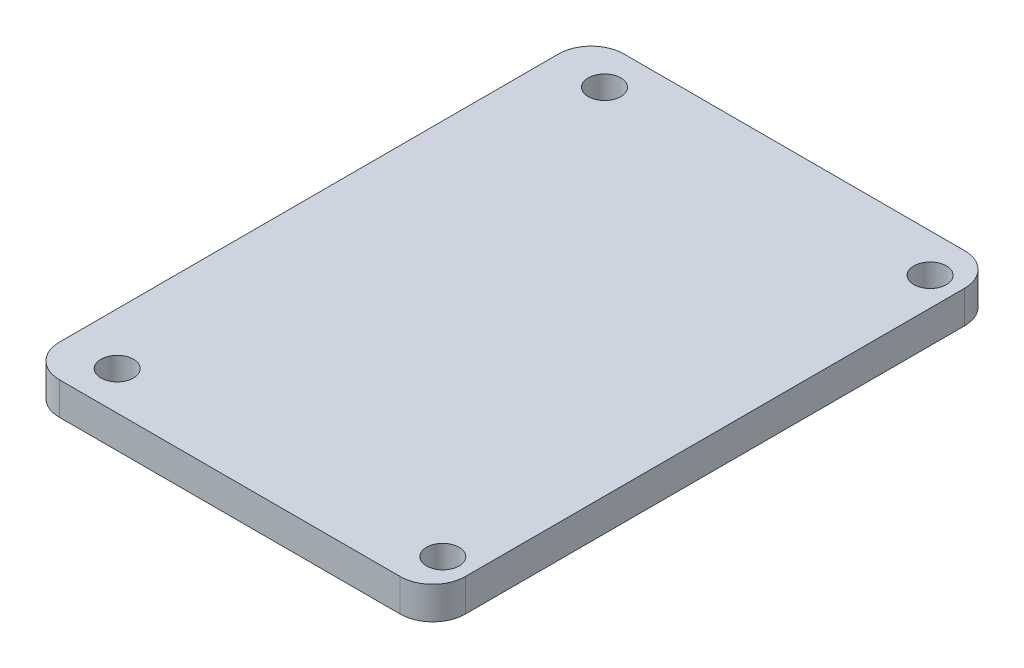
ISO-10303-21;
HEADER;
FILE_DESCRIPTION(('STEP AP214'),'2;1');
FILE_NAME('part.step','',(''),(''),'','','');
FILE_SCHEMA(('AUTOMOTIVE_DESIGN { 1 0 10303 214 1 1 1 1 }'));
ENDSEC;
DATA;
#1=APPLICATION_CONTEXT('core data for automotive mechanical design processes');
#2=APPLICATION_PROTOCOL_DEFINITION('international standard','automotive_design',2000,#1);
#3=PRODUCT_CONTEXT('',#1,'mechanical');
#4=PRODUCT('Part','Part','',(#3));
#5=PRODUCT_RELATED_PRODUCT_CATEGORY('part','',(#4));
#6=PRODUCT_DEFINITION_FORMATION('','',#4);
#7=PRODUCT_DEFINITION_CONTEXT('part definition',#1,'design');
#8=PRODUCT_DEFINITION('design','',#6,#7);
#9=PRODUCT_DEFINITION_SHAPE('','',#8);
#10=(LENGTH_UNIT() NAMED_UNIT(*) SI_UNIT(.MILLI.,.METRE.));
#11=(NAMED_UNIT(*) PLANE_ANGLE_UNIT() SI_UNIT($,.RADIAN.));
#12=(NAMED_UNIT(*) SI_UNIT($,.STERADIAN.) SOLID_ANGLE_UNIT());
#13=UNCERTAINTY_MEASURE_WITH_UNIT(LENGTH_MEASURE(1.E-05),#10,'distance_accuracy_value','');
#14=(GEOMETRIC_REPRESENTATION_CONTEXT(3) GLOBAL_UNCERTAINTY_ASSIGNED_CONTEXT((#13)) GLOBAL_UNIT_ASSIGNED_CONTEXT((#10,
#11,#12)) REPRESENTATION_CONTEXT('',''));
#15=CARTESIAN_POINT('',(0.,0.,0.));
#16=DIRECTION('',(0.,0.,1.));
#17=DIRECTION('',(1.,0.,0.));
#18=AXIS2_PLACEMENT_3D('',#15,#16,#17);
#19=CARTESIAN_POINT('',(0.,3.,26.));
#20=DIRECTION('',(0.,0.,-1.));
#21=DIRECTION('',(-1.,0.,0.));
#22=AXIS2_PLACEMENT_3D('',#19,#20,#21);
#23=PLANE('',#22);
#24=DIRECTION('',(1.,0.,0.));
#25=VECTOR('',#24,1.);
#26=CARTESIAN_POINT('',(0.,3.,26.));
#27=LINE('',#26,#25);
#28=CARTESIAN_POINT('',(-6.89999999999999,3.,26.));
#29=VERTEX_POINT('',#28);
#30=CARTESIAN_POINT('',(24.5,3.,26.));
#31=VERTEX_POINT('',#30);
#32=EDGE_CURVE('E190',#29,#31,#27,.T.);
#33=ORIENTED_EDGE('',*,*,#32,.F.);
#34=DIRECTION('',(0.,1.,0.));
#35=VECTOR('',#34,1.);
#36=CARTESIAN_POINT('',(-6.89999999999999,0.,26.));
#37=LINE('',#36,#35);
#38=CARTESIAN_POINT('',(-6.89999999999999,0.,26.));
#39=VERTEX_POINT('',#38);
#40=EDGE_CURVE('E70',#29,#39,#37,.F.);
#41=ORIENTED_EDGE('',*,*,#40,.T.);
#42=DIRECTION('',(1.,0.,0.));
#43=VECTOR('',#42,1.);
#44=CARTESIAN_POINT('',(0.,0.,26.));
#45=LINE('',#44,#43);
#46=CARTESIAN_POINT('',(24.5,0.,26.));
#47=VERTEX_POINT('',#46);
#48=EDGE_CURVE('E138',#39,#47,#45,.T.);
#49=ORIENTED_EDGE('',*,*,#48,.T.);
#50=DIRECTION('',(0.,-1.,0.));
#51=VECTOR('',#50,1.);
#52=CARTESIAN_POINT('',(24.5,3.,26.));
#53=LINE('',#52,#51);
#54=EDGE_CURVE('E121',#47,#31,#53,.F.);
#55=ORIENTED_EDGE('',*,*,#54,.T.);
#56=EDGE_LOOP('',(#33,#41,#49,#55));
#57=FACE_BOUND('',#56,.T.);
#58=ADVANCED_FACE('F47',(#57),#23,.F.);
#59=CARTESIAN_POINT('',(0.,3.,-26.));
#60=DIRECTION('',(0.,0.,-1.));
#61=DIRECTION('',(-1.,0.,0.));
#62=AXIS2_PLACEMENT_3D('',#59,#60,#61);
#63=PLANE('',#62);
#64=DIRECTION('',(1.,0.,0.));
#65=VECTOR('',#64,1.);
#66=CARTESIAN_POINT('',(0.,0.,-26.));
#67=LINE('',#66,#65);
#68=CARTESIAN_POINT('',(-6.89999999999999,0.,-26.));
#69=VERTEX_POINT('',#68);
#70=CARTESIAN_POINT('',(24.5,0.,-26.));
#71=VERTEX_POINT('',#70);
#72=EDGE_CURVE('E137',#69,#71,#67,.T.);
#73=ORIENTED_EDGE('',*,*,#72,.F.);
#74=DIRECTION('',(0.,1.,0.));
#75=VECTOR('',#74,1.);
#76=CARTESIAN_POINT('',(-6.89999999999999,3.,-26.));
#77=LINE('',#76,#75);
#78=CARTESIAN_POINT('',(-6.89999999999999,3.,-26.));
#79=VERTEX_POINT('',#78);
#80=EDGE_CURVE('E11',#69,#79,#77,.T.);
#81=ORIENTED_EDGE('',*,*,#80,.T.);
#82=DIRECTION('',(1.,0.,0.));
#83=VECTOR('',#82,1.);
#84=CARTESIAN_POINT('',(0.,3.,-26.));
#85=LINE('',#84,#83);
#86=CARTESIAN_POINT('',(24.5,3.,-26.));
#87=VERTEX_POINT('',#86);
#88=EDGE_CURVE('E146',#79,#87,#85,.T.);
#89=ORIENTED_EDGE('',*,*,#88,.T.);
#90=DIRECTION('',(0.,-1.,0.));
#91=VECTOR('',#90,1.);
#92=CARTESIAN_POINT('',(24.5,0.,-26.));
#93=LINE('',#92,#91);
#94=EDGE_CURVE('E155',#87,#71,#93,.T.);
#95=ORIENTED_EDGE('',*,*,#94,.T.);
#96=EDGE_LOOP('',(#73,#81,#89,#95));
#97=FACE_BOUND('',#96,.T.);
#98=ADVANCED_FACE('F220',(#97),#63,.T.);
#99=CARTESIAN_POINT('',(0.,3.,0.));
#100=DIRECTION('',(0.,1.,0.));
#101=DIRECTION('',(0.,0.,1.));
#102=AXIS2_PLACEMENT_3D('',#99,#100,#101);
#103=PLANE('',#102);
#104=CARTESIAN_POINT('',(24.8750000000005,3.,22.45));
#105=DIRECTION('',(0.,1.,0.));
#106=DIRECTION('',(0.,0.,1.));
#107=AXIS2_PLACEMENT_3D('',#104,#105,#106);
#108=CIRCLE('',#107,1.5);
#109=CARTESIAN_POINT('',(24.8750000000005,3.,23.95));
#110=VERTEX_POINT('',#109);
#111=EDGE_CURVE('E192',#110,#110,#108,.T.);
#112=ORIENTED_EDGE('',*,*,#111,.F.);
#113=EDGE_LOOP('',(#112));
#114=FACE_BOUND('',#113,.T.);
#115=CARTESIAN_POINT('',(24.875,3.,-22.45));
#116=DIRECTION('',(0.,1.,0.));
#117=DIRECTION('',(0.,0.,1.));
#118=AXIS2_PLACEMENT_3D('',#115,#116,#117);
#119=CIRCLE('',#118,1.5);
#120=CARTESIAN_POINT('',(24.875,3.,-20.95));
#121=VERTEX_POINT('',#120);
#122=EDGE_CURVE('E140',#121,#121,#119,.T.);
#123=ORIENTED_EDGE('',*,*,#122,.F.);
#124=EDGE_LOOP('',(#123));
#125=FACE_BOUND('',#124,.T.);
#126=CARTESIAN_POINT('',(-5.125,3.,-22.4499999999998));
#127=DIRECTION('',(0.,1.,0.));
#128=DIRECTION('',(0.,0.,1.));
#129=AXIS2_PLACEMENT_3D('',#126,#127,#128);
#130=CIRCLE('',#129,1.5);
#131=CARTESIAN_POINT('',(-5.125,3.,-20.9499999999998));
#132=VERTEX_POINT('',#131);
#133=EDGE_CURVE('E163',#132,#132,#130,.T.);
#134=ORIENTED_EDGE('',*,*,#133,.F.);
#135=EDGE_LOOP('',(#134));
#136=FACE_BOUND('',#135,.T.);
#137=CARTESIAN_POINT('',(-5.12499999999953,3.,22.4500000000002));
#138=DIRECTION('',(0.,1.,0.));
#139=DIRECTION('',(0.,0.,1.));
#140=AXIS2_PLACEMENT_3D('',#137,#138,#139);
#141=CIRCLE('',#140,1.5);
#142=CARTESIAN_POINT('',(-5.12499999999953,3.,23.9500000000002));
#143=VERTEX_POINT('',#142);
#144=EDGE_CURVE('E343',#143,#143,#141,.T.);
#145=ORIENTED_EDGE('',*,*,#144,.F.);
#146=EDGE_LOOP('',(#145));
#147=FACE_BOUND('',#146,.T.);
#148=DIRECTION('',(0.,0.,1.));
#149=VECTOR('',#148,1.);
#150=CARTESIAN_POINT('',(-9.89999999999999,3.,0.));
#151=LINE('',#150,#149);
#152=CARTESIAN_POINT('',(-9.89999999999999,3.,-23.));
#153=VERTEX_POINT('',#152);
#154=CARTESIAN_POINT('',(-9.89999999999999,3.,23.));
#155=VERTEX_POINT('',#154);
#156=EDGE_CURVE('E191',#153,#155,#151,.T.);
#157=ORIENTED_EDGE('',*,*,#156,.T.);
#158=CARTESIAN_POINT('',(-6.89999999999999,3.,23.));
#159=DIRECTION('',(0.,1.,0.));
#160=DIRECTION('',(0.,0.,1.));
#161=AXIS2_PLACEMENT_3D('',#158,#159,#160);
#162=CIRCLE('',#161,3.);
#163=EDGE_CURVE('E176',#155,#29,#162,.T.);
#164=ORIENTED_EDGE('',*,*,#163,.T.);
#165=ORIENTED_EDGE('',*,*,#32,.T.);
#166=CARTESIAN_POINT('',(24.5,3.,23.));
#167=DIRECTION('',(0.,1.,0.));
#168=DIRECTION('',(0.,0.,1.));
#169=AXIS2_PLACEMENT_3D('',#166,#167,#168);
#170=CIRCLE('',#169,3.);
#171=CARTESIAN_POINT('',(27.5,3.,23.));
#172=VERTEX_POINT('',#171);
#173=EDGE_CURVE('E153',#31,#172,#170,.T.);
#174=ORIENTED_EDGE('',*,*,#173,.T.);
#175=DIRECTION('',(0.,0.,-1.));
#176=VECTOR('',#175,1.);
#177=CARTESIAN_POINT('',(27.5,3.,0.));
#178=LINE('',#177,#176);
#179=CARTESIAN_POINT('',(27.5,3.,-23.));
#180=VERTEX_POINT('',#179);
#181=EDGE_CURVE('E132',#172,#180,#178,.T.);
#182=ORIENTED_EDGE('',*,*,#181,.T.);
#183=CARTESIAN_POINT('',(24.5,3.,-23.));
#184=DIRECTION('',(0.,1.,0.));
#185=DIRECTION('',(0.,0.,1.));
#186=AXIS2_PLACEMENT_3D('',#183,#184,#185);
#187=CIRCLE('',#186,3.);
#188=EDGE_CURVE('E150',#180,#87,#187,.T.);
#189=ORIENTED_EDGE('',*,*,#188,.T.);
#190=ORIENTED_EDGE('',*,*,#88,.F.);
#191=CARTESIAN_POINT('',(-6.89999999999999,3.,-23.));
#192=DIRECTION('',(0.,1.,0.));
#193=DIRECTION('',(0.,0.,1.));
#194=AXIS2_PLACEMENT_3D('',#191,#192,#193);
#195=CIRCLE('',#194,3.);
#196=EDGE_CURVE('E174',#79,#153,#195,.T.);
#197=ORIENTED_EDGE('',*,*,#196,.T.);
#198=EDGE_LOOP('',(#157,#164,#165,#174,#182,#189,#190,#197));
#199=FACE_BOUND('',#198,.T.);
#200=ADVANCED_FACE('F189',(#114,#125,#136,#147,#199),#103,.T.);
#201=CARTESIAN_POINT('',(0.,0.,0.));
#202=DIRECTION('',(0.,1.,0.));
#203=DIRECTION('',(0.,0.,1.));
#204=AXIS2_PLACEMENT_3D('',#201,#202,#203);
#205=PLANE('',#204);
#206=CARTESIAN_POINT('',(24.8750000000005,0.,22.45));
#207=DIRECTION('',(0.,1.,0.));
#208=DIRECTION('',(0.,0.,1.));
#209=AXIS2_PLACEMENT_3D('',#206,#207,#208);
#210=CIRCLE('',#209,1.5);
#211=CARTESIAN_POINT('',(24.8750000000005,0.,23.95));
#212=VERTEX_POINT('',#211);
#213=EDGE_CURVE('E142',#212,#212,#210,.T.);
#214=ORIENTED_EDGE('',*,*,#213,.T.);
#215=EDGE_LOOP('',(#214));
#216=FACE_BOUND('',#215,.T.);
#217=CARTESIAN_POINT('',(24.875,0.,-22.45));
#218=DIRECTION('',(0.,1.,0.));
#219=DIRECTION('',(0.,0.,1.));
#220=AXIS2_PLACEMENT_3D('',#217,#218,#219);
#221=CIRCLE('',#220,1.5);
#222=CARTESIAN_POINT('',(24.875,0.,-20.95));
#223=VERTEX_POINT('',#222);
#224=EDGE_CURVE('E166',#223,#223,#221,.T.);
#225=ORIENTED_EDGE('',*,*,#224,.T.);
#226=EDGE_LOOP('',(#225));
#227=FACE_BOUND('',#226,.T.);
#228=CARTESIAN_POINT('',(-5.125,0.,-22.4499999999998));
#229=DIRECTION('',(0.,1.,0.));
#230=DIRECTION('',(0.,0.,1.));
#231=AXIS2_PLACEMENT_3D('',#228,#229,#230);
#232=CIRCLE('',#231,1.5);
#233=CARTESIAN_POINT('',(-5.125,0.,-20.9499999999998));
#234=VERTEX_POINT('',#233);
#235=EDGE_CURVE('E159',#234,#234,#232,.T.);
#236=ORIENTED_EDGE('',*,*,#235,.T.);
#237=EDGE_LOOP('',(#236));
#238=FACE_BOUND('',#237,.T.);
#239=CARTESIAN_POINT('',(-5.12499999999953,0.,22.4500000000002));
#240=DIRECTION('',(0.,1.,0.));
#241=DIRECTION('',(0.,0.,1.));
#242=AXIS2_PLACEMENT_3D('',#239,#240,#241);
#243=CIRCLE('',#242,1.5);
#244=CARTESIAN_POINT('',(-5.12499999999953,0.,23.9500000000002));
#245=VERTEX_POINT('',#244);
#246=EDGE_CURVE('E162',#245,#245,#243,.T.);
#247=ORIENTED_EDGE('',*,*,#246,.T.);
#248=EDGE_LOOP('',(#247));
#249=FACE_BOUND('',#248,.T.);
#250=ORIENTED_EDGE('',*,*,#48,.F.);
#251=CARTESIAN_POINT('',(-6.89999999999999,0.,23.));
#252=DIRECTION('',(0.,1.,0.));
#253=DIRECTION('',(0.,0.,1.));
#254=AXIS2_PLACEMENT_3D('',#251,#252,#253);
#255=CIRCLE('',#254,3.);
#256=CARTESIAN_POINT('',(-9.89999999999999,0.,23.));
#257=VERTEX_POINT('',#256);
#258=EDGE_CURVE('E55',#39,#257,#255,.F.);
#259=ORIENTED_EDGE('',*,*,#258,.T.);
#260=DIRECTION('',(0.,0.,1.));
#261=VECTOR('',#260,1.);
#262=CARTESIAN_POINT('',(-9.89999999999999,0.,0.));
#263=LINE('',#262,#261);
#264=CARTESIAN_POINT('',(-9.89999999999999,0.,-23.));
#265=VERTEX_POINT('',#264);
#266=EDGE_CURVE('E158',#265,#257,#263,.T.);
#267=ORIENTED_EDGE('',*,*,#266,.F.);
#268=CARTESIAN_POINT('',(-6.89999999999999,0.,-23.));
#269=DIRECTION('',(0.,1.,0.));
#270=DIRECTION('',(0.,0.,1.));
#271=AXIS2_PLACEMENT_3D('',#268,#269,#270);
#272=CIRCLE('',#271,3.);
#273=EDGE_CURVE('E62',#265,#69,#272,.F.);
#274=ORIENTED_EDGE('',*,*,#273,.T.);
#275=ORIENTED_EDGE('',*,*,#72,.T.);
#276=CARTESIAN_POINT('',(24.5,0.,-23.));
#277=DIRECTION('',(0.,1.,0.));
#278=DIRECTION('',(0.,0.,1.));
#279=AXIS2_PLACEMENT_3D('',#276,#277,#278);
#280=CIRCLE('',#279,3.);
#281=CARTESIAN_POINT('',(27.5,0.,-23.));
#282=VERTEX_POINT('',#281);
#283=EDGE_CURVE('E123',#71,#282,#280,.F.);
#284=ORIENTED_EDGE('',*,*,#283,.T.);
#285=DIRECTION('',(0.,0.,-1.));
#286=VECTOR('',#285,1.);
#287=CARTESIAN_POINT('',(27.5,0.,0.));
#288=LINE('',#287,#286);
#289=CARTESIAN_POINT('',(27.5,0.,23.));
#290=VERTEX_POINT('',#289);
#291=EDGE_CURVE('E129',#290,#282,#288,.T.);
#292=ORIENTED_EDGE('',*,*,#291,.F.);
#293=CARTESIAN_POINT('',(24.5,0.,23.));
#294=DIRECTION('',(0.,1.,0.));
#295=DIRECTION('',(0.,0.,1.));
#296=AXIS2_PLACEMENT_3D('',#293,#294,#295);
#297=CIRCLE('',#296,3.);
#298=EDGE_CURVE('E115',#290,#47,#297,.F.);
#299=ORIENTED_EDGE('',*,*,#298,.T.);
#300=EDGE_LOOP('',(#250,#259,#267,#274,#275,#284,#292,#299));
#301=FACE_BOUND('',#300,.T.);
#302=ADVANCED_FACE('F135',(#216,#227,#238,#249,#301),#205,.F.);
#303=CARTESIAN_POINT('',(27.5,3.,0.));
#304=DIRECTION('',(-1.,0.,0.));
#305=DIRECTION('',(0.,0.,1.));
#306=AXIS2_PLACEMENT_3D('',#303,#304,#305);
#307=PLANE('',#306);
#308=ORIENTED_EDGE('',*,*,#181,.F.);
#309=DIRECTION('',(0.,-1.,0.));
#310=VECTOR('',#309,1.);
#311=CARTESIAN_POINT('',(27.5,3.,23.));
#312=LINE('',#311,#310);
#313=EDGE_CURVE('E119',#172,#290,#312,.T.);
#314=ORIENTED_EDGE('',*,*,#313,.T.);
#315=ORIENTED_EDGE('',*,*,#291,.T.);
#316=DIRECTION('',(0.,-1.,0.));
#317=VECTOR('',#316,1.);
#318=CARTESIAN_POINT('',(27.5,3.,-23.));
#319=LINE('',#318,#317);
#320=EDGE_CURVE('E133',#282,#180,#319,.F.);
#321=ORIENTED_EDGE('',*,*,#320,.T.);
#322=EDGE_LOOP('',(#308,#314,#315,#321));
#323=FACE_BOUND('',#322,.T.);
#324=ADVANCED_FACE('F128',(#323),#307,.F.);
#325=CARTESIAN_POINT('',(24.8750000000005,3.,22.45));
#326=DIRECTION('',(0.,-1.,0.));
#327=DIRECTION('',(0.,0.,-1.));
#328=AXIS2_PLACEMENT_3D('',#325,#326,#327);
#329=CYLINDRICAL_SURFACE('',#328,1.5);
#330=ORIENTED_EDGE('',*,*,#111,.T.);
#331=EDGE_LOOP('',(#330));
#332=FACE_BOUND('',#331,.T.);
#333=ORIENTED_EDGE('',*,*,#213,.F.);
#334=EDGE_LOOP('',(#333));
#335=FACE_BOUND('',#334,.T.);
#336=ADVANCED_FACE('F206',(#332,#335),#329,.F.);
#337=CARTESIAN_POINT('',(24.875,3.,-22.45));
#338=DIRECTION('',(0.,-1.,0.));
#339=DIRECTION('',(0.,0.,-1.));
#340=AXIS2_PLACEMENT_3D('',#337,#338,#339);
#341=CYLINDRICAL_SURFACE('',#340,1.5);
#342=ORIENTED_EDGE('',*,*,#122,.T.);
#343=EDGE_LOOP('',(#342));
#344=FACE_BOUND('',#343,.T.);
#345=ORIENTED_EDGE('',*,*,#224,.F.);
#346=EDGE_LOOP('',(#345));
#347=FACE_BOUND('',#346,.T.);
#348=ADVANCED_FACE('F208',(#344,#347),#341,.F.);
#349=CARTESIAN_POINT('',(24.5,3.,23.));
#350=DIRECTION('',(0.,-1.,0.));
#351=DIRECTION('',(0.,0.,-1.));
#352=AXIS2_PLACEMENT_3D('',#349,#350,#351);
#353=CYLINDRICAL_SURFACE('',#352,3.);
#354=ORIENTED_EDGE('',*,*,#173,.F.);
#355=ORIENTED_EDGE('',*,*,#54,.F.);
#356=ORIENTED_EDGE('',*,*,#298,.F.);
#357=ORIENTED_EDGE('',*,*,#313,.F.);
#358=EDGE_LOOP('',(#354,#355,#356,#357));
#359=FACE_BOUND('',#358,.T.);
#360=ADVANCED_FACE('F118',(#359),#353,.T.);
#361=CARTESIAN_POINT('',(24.5,3.,-23.));
#362=DIRECTION('',(0.,1.,0.));
#363=DIRECTION('',(0.,0.,1.));
#364=AXIS2_PLACEMENT_3D('',#361,#362,#363);
#365=CYLINDRICAL_SURFACE('',#364,3.);
#366=ORIENTED_EDGE('',*,*,#188,.F.);
#367=ORIENTED_EDGE('',*,*,#320,.F.);
#368=ORIENTED_EDGE('',*,*,#283,.F.);
#369=ORIENTED_EDGE('',*,*,#94,.F.);
#370=EDGE_LOOP('',(#366,#367,#368,#369));
#371=FACE_BOUND('',#370,.T.);
#372=ADVANCED_FACE('F239',(#371),#365,.T.);
#373=CARTESIAN_POINT('',(-5.125,-7.,-22.4499999999998));
#374=DIRECTION('',(0.,1.,0.));
#375=DIRECTION('',(0.,0.,1.));
#376=AXIS2_PLACEMENT_3D('',#373,#374,#375);
#377=CYLINDRICAL_SURFACE('',#376,1.5);
#378=ORIENTED_EDGE('',*,*,#133,.T.);
#379=EDGE_LOOP('',(#378));
#380=FACE_BOUND('',#379,.T.);
#381=ORIENTED_EDGE('',*,*,#235,.F.);
#382=EDGE_LOOP('',(#381));
#383=FACE_BOUND('',#382,.T.);
#384=ADVANCED_FACE('F235',(#380,#383),#377,.F.);
#385=CARTESIAN_POINT('',(-5.12499999999953,-7.,22.4500000000002));
#386=DIRECTION('',(0.,1.,0.));
#387=DIRECTION('',(0.,0.,1.));
#388=AXIS2_PLACEMENT_3D('',#385,#386,#387);
#389=CYLINDRICAL_SURFACE('',#388,1.5);
#390=ORIENTED_EDGE('',*,*,#144,.T.);
#391=EDGE_LOOP('',(#390));
#392=FACE_BOUND('',#391,.T.);
#393=ORIENTED_EDGE('',*,*,#246,.F.);
#394=EDGE_LOOP('',(#393));
#395=FACE_BOUND('',#394,.T.);
#396=ADVANCED_FACE('F233',(#392,#395),#389,.F.);
#397=CARTESIAN_POINT('',(-9.89999999999999,-7.,0.));
#398=DIRECTION('',(-1.,0.,0.));
#399=DIRECTION('',(0.,0.,1.));
#400=AXIS2_PLACEMENT_3D('',#397,#398,#399);
#401=PLANE('',#400);
#402=ORIENTED_EDGE('',*,*,#266,.T.);
#403=DIRECTION('',(0.,1.,0.));
#404=VECTOR('',#403,1.);
#405=CARTESIAN_POINT('',(-9.89999999999999,3.,23.));
#406=LINE('',#405,#404);
#407=EDGE_CURVE('E171',#257,#155,#406,.T.);
#408=ORIENTED_EDGE('',*,*,#407,.T.);
#409=ORIENTED_EDGE('',*,*,#156,.F.);
#410=DIRECTION('',(0.,1.,0.));
#411=VECTOR('',#410,1.);
#412=CARTESIAN_POINT('',(-9.89999999999999,-7.,-23.));
#413=LINE('',#412,#411);
#414=EDGE_CURVE('E169',#153,#265,#413,.F.);
#415=ORIENTED_EDGE('',*,*,#414,.T.);
#416=EDGE_LOOP('',(#402,#408,#409,#415));
#417=FACE_BOUND('',#416,.T.);
#418=ADVANCED_FACE('F183',(#417),#401,.T.);
#419=CARTESIAN_POINT('',(-6.89999999999999,-7.,23.));
#420=DIRECTION('',(0.,-1.,0.));
#421=DIRECTION('',(0.,0.,-1.));
#422=AXIS2_PLACEMENT_3D('',#419,#420,#421);
#423=CYLINDRICAL_SURFACE('',#422,3.);
#424=ORIENTED_EDGE('',*,*,#258,.F.);
#425=ORIENTED_EDGE('',*,*,#40,.F.);
#426=ORIENTED_EDGE('',*,*,#163,.F.);
#427=ORIENTED_EDGE('',*,*,#407,.F.);
#428=EDGE_LOOP('',(#424,#425,#426,#427));
#429=FACE_BOUND('',#428,.T.);
#430=ADVANCED_FACE('F187',(#429),#423,.T.);
#431=CARTESIAN_POINT('',(-6.89999999999999,3.,-23.));
#432=DIRECTION('',(0.,1.,0.));
#433=DIRECTION('',(0.,0.,1.));
#434=AXIS2_PLACEMENT_3D('',#431,#432,#433);
#435=CYLINDRICAL_SURFACE('',#434,3.);
#436=ORIENTED_EDGE('',*,*,#273,.F.);
#437=ORIENTED_EDGE('',*,*,#414,.F.);
#438=ORIENTED_EDGE('',*,*,#196,.F.);
#439=ORIENTED_EDGE('',*,*,#80,.F.);
#440=EDGE_LOOP('',(#436,#437,#438,#439));
#441=FACE_BOUND('',#440,.T.);
#442=ADVANCED_FACE('F49',(#441),#435,.T.);
#443=CLOSED_SHELL('',(#58,#98,#200,#302,#324,#336,#348,#360,#372,#384,#396,#418,#430,#442));
#444=MANIFOLD_SOLID_BREP('B2',#443);
#445=ADVANCED_BREP_SHAPE_REPRESENTATION('',(#18,#444),#14);
#446=SHAPE_DEFINITION_REPRESENTATION(#9,#445);
ENDSEC;
END-ISO-10303-21;
